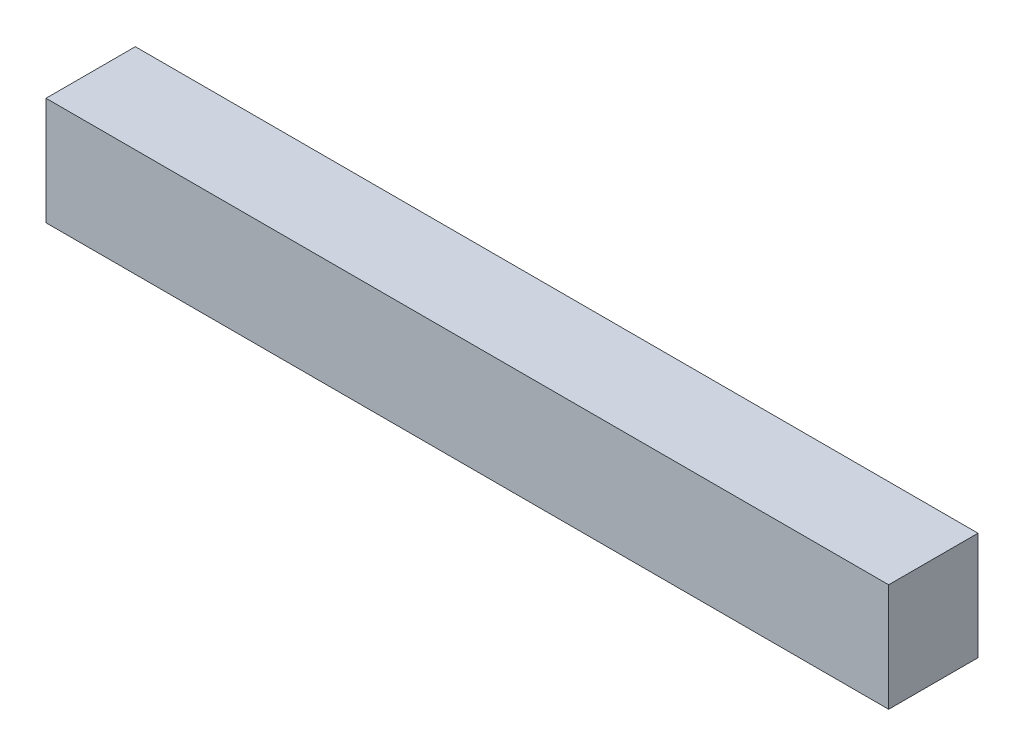
ISO-10303-21;
HEADER;
FILE_DESCRIPTION(('STEP AP214'),'2;1');
FILE_NAME('part.step','',(''),(''),'','','');
FILE_SCHEMA(('AUTOMOTIVE_DESIGN { 1 0 10303 214 1 1 1 1 }'));
ENDSEC;
DATA;
#1=APPLICATION_CONTEXT('core data for automotive mechanical design processes');
#2=APPLICATION_PROTOCOL_DEFINITION('international standard','automotive_design',2000,#1);
#3=PRODUCT_CONTEXT('',#1,'mechanical');
#4=PRODUCT('Part','Part','',(#3));
#5=PRODUCT_RELATED_PRODUCT_CATEGORY('part','',(#4));
#6=PRODUCT_DEFINITION_FORMATION('','',#4);
#7=PRODUCT_DEFINITION_CONTEXT('part definition',#1,'design');
#8=PRODUCT_DEFINITION('design','',#6,#7);
#9=PRODUCT_DEFINITION_SHAPE('','',#8);
#10=(LENGTH_UNIT() NAMED_UNIT(*) SI_UNIT(.MILLI.,.METRE.));
#11=(NAMED_UNIT(*) PLANE_ANGLE_UNIT() SI_UNIT($,.RADIAN.));
#12=(NAMED_UNIT(*) SI_UNIT($,.STERADIAN.) SOLID_ANGLE_UNIT());
#13=UNCERTAINTY_MEASURE_WITH_UNIT(LENGTH_MEASURE(1.E-05),#10,'distance_accuracy_value','');
#14=(GEOMETRIC_REPRESENTATION_CONTEXT(3) GLOBAL_UNCERTAINTY_ASSIGNED_CONTEXT((#13)) GLOBAL_UNIT_ASSIGNED_CONTEXT((#10,
#11,#12)) REPRESENTATION_CONTEXT('',''));
#15=CARTESIAN_POINT('',(0.,0.,0.));
#16=DIRECTION('',(0.,0.,1.));
#17=DIRECTION('',(1.,0.,0.));
#18=AXIS2_PLACEMENT_3D('',#15,#16,#17);
#19=CARTESIAN_POINT('',(0.,0.,3.18));
#20=DIRECTION('',(1.,0.,0.));
#21=DIRECTION('',(0.,0.,-1.));
#22=AXIS2_PLACEMENT_3D('',#19,#20,#21);
#23=PLANE('',#22);
#24=DIRECTION('',(0.,-1.,0.));
#25=VECTOR('',#24,1.);
#26=CARTESIAN_POINT('',(0.,0.,0.));
#27=LINE('',#26,#25);
#28=CARTESIAN_POINT('',(0.,3.84,0.));
#29=VERTEX_POINT('',#28);
#30=CARTESIAN_POINT('',(0.,0.,0.));
#31=VERTEX_POINT('',#30);
#32=EDGE_CURVE('E100',#29,#31,#27,.T.);
#33=ORIENTED_EDGE('',*,*,#32,.T.);
#34=DIRECTION('',(0.,0.,-1.));
#35=VECTOR('',#34,1.);
#36=CARTESIAN_POINT('',(0.,0.,3.18));
#37=LINE('',#36,#35);
#38=CARTESIAN_POINT('',(0.,0.,3.18));
#39=VERTEX_POINT('',#38);
#40=EDGE_CURVE('E11',#39,#31,#37,.T.);
#41=ORIENTED_EDGE('',*,*,#40,.F.);
#42=DIRECTION('',(0.,-1.,0.));
#43=VECTOR('',#42,1.);
#44=CARTESIAN_POINT('',(0.,0.,3.18));
#45=LINE('',#44,#43);
#46=CARTESIAN_POINT('',(0.,3.84,3.18));
#47=VERTEX_POINT('',#46);
#48=EDGE_CURVE('E88',#47,#39,#45,.T.);
#49=ORIENTED_EDGE('',*,*,#48,.F.);
#50=DIRECTION('',(0.,0.,-1.));
#51=VECTOR('',#50,1.);
#52=CARTESIAN_POINT('',(0.,3.84,3.18));
#53=LINE('',#52,#51);
#54=EDGE_CURVE('E96',#47,#29,#53,.T.);
#55=ORIENTED_EDGE('',*,*,#54,.T.);
#56=EDGE_LOOP('',(#33,#41,#49,#55));
#57=FACE_BOUND('',#56,.T.);
#58=ADVANCED_FACE('F37',(#57),#23,.F.);
#59=CARTESIAN_POINT('',(0.,0.,3.18));
#60=DIRECTION('',(0.,1.,0.));
#61=DIRECTION('',(0.,0.,1.));
#62=AXIS2_PLACEMENT_3D('',#59,#60,#61);
#63=PLANE('',#62);
#64=DIRECTION('',(1.,0.,0.));
#65=VECTOR('',#64,1.);
#66=CARTESIAN_POINT('',(0.,0.,0.));
#67=LINE('',#66,#65);
#68=CARTESIAN_POINT('',(30.,0.,0.));
#69=VERTEX_POINT('',#68);
#70=EDGE_CURVE('E92',#31,#69,#67,.T.);
#71=ORIENTED_EDGE('',*,*,#70,.T.);
#72=DIRECTION('',(0.,0.,-1.));
#73=VECTOR('',#72,1.);
#74=CARTESIAN_POINT('',(30.,0.,3.18));
#75=LINE('',#74,#73);
#76=CARTESIAN_POINT('',(30.,0.,3.18));
#77=VERTEX_POINT('',#76);
#78=EDGE_CURVE('E45',#77,#69,#75,.T.);
#79=ORIENTED_EDGE('',*,*,#78,.F.);
#80=DIRECTION('',(1.,0.,0.));
#81=VECTOR('',#80,1.);
#82=CARTESIAN_POINT('',(0.,0.,3.18));
#83=LINE('',#82,#81);
#84=EDGE_CURVE('E83',#39,#77,#83,.T.);
#85=ORIENTED_EDGE('',*,*,#84,.F.);
#86=ORIENTED_EDGE('',*,*,#40,.T.);
#87=EDGE_LOOP('',(#71,#79,#85,#86));
#88=FACE_BOUND('',#87,.T.);
#89=ADVANCED_FACE('F91',(#88),#63,.F.);
#90=CARTESIAN_POINT('',(30.,0.,3.18));
#91=DIRECTION('',(-1.,0.,0.));
#92=DIRECTION('',(0.,0.,1.));
#93=AXIS2_PLACEMENT_3D('',#90,#91,#92);
#94=PLANE('',#93);
#95=DIRECTION('',(0.,1.,0.));
#96=VECTOR('',#95,1.);
#97=CARTESIAN_POINT('',(30.,0.,0.));
#98=LINE('',#97,#96);
#99=CARTESIAN_POINT('',(30.,3.84,0.));
#100=VERTEX_POINT('',#99);
#101=EDGE_CURVE('E70',#69,#100,#98,.T.);
#102=ORIENTED_EDGE('',*,*,#101,.T.);
#103=DIRECTION('',(0.,0.,-1.));
#104=VECTOR('',#103,1.);
#105=CARTESIAN_POINT('',(30.,3.84,3.18));
#106=LINE('',#105,#104);
#107=CARTESIAN_POINT('',(30.,3.84,3.18));
#108=VERTEX_POINT('',#107);
#109=EDGE_CURVE('E93',#108,#100,#106,.T.);
#110=ORIENTED_EDGE('',*,*,#109,.F.);
#111=DIRECTION('',(0.,1.,0.));
#112=VECTOR('',#111,1.);
#113=CARTESIAN_POINT('',(30.,0.,3.18));
#114=LINE('',#113,#112);
#115=EDGE_CURVE('E86',#77,#108,#114,.T.);
#116=ORIENTED_EDGE('',*,*,#115,.F.);
#117=ORIENTED_EDGE('',*,*,#78,.T.);
#118=EDGE_LOOP('',(#102,#110,#116,#117));
#119=FACE_BOUND('',#118,.T.);
#120=ADVANCED_FACE('F94',(#119),#94,.F.);
#121=CARTESIAN_POINT('',(0.,3.84,3.18));
#122=DIRECTION('',(0.,-1.,0.));
#123=DIRECTION('',(0.,0.,-1.));
#124=AXIS2_PLACEMENT_3D('',#121,#122,#123);
#125=PLANE('',#124);
#126=DIRECTION('',(-1.,0.,0.));
#127=VECTOR('',#126,1.);
#128=CARTESIAN_POINT('',(0.,3.84,0.));
#129=LINE('',#128,#127);
#130=EDGE_CURVE('E76',#100,#29,#129,.T.);
#131=ORIENTED_EDGE('',*,*,#130,.T.);
#132=ORIENTED_EDGE('',*,*,#54,.F.);
#133=DIRECTION('',(-1.,0.,0.));
#134=VECTOR('',#133,1.);
#135=CARTESIAN_POINT('',(0.,3.84,3.18));
#136=LINE('',#135,#134);
#137=EDGE_CURVE('E53',#108,#47,#136,.T.);
#138=ORIENTED_EDGE('',*,*,#137,.F.);
#139=ORIENTED_EDGE('',*,*,#109,.T.);
#140=EDGE_LOOP('',(#131,#132,#138,#139));
#141=FACE_BOUND('',#140,.T.);
#142=ADVANCED_FACE('F107',(#141),#125,.F.);
#143=CARTESIAN_POINT('',(0.,0.,3.18));
#144=DIRECTION('',(0.,0.,-1.));
#145=DIRECTION('',(-1.,0.,0.));
#146=AXIS2_PLACEMENT_3D('',#143,#144,#145);
#147=PLANE('',#146);
#148=ORIENTED_EDGE('',*,*,#48,.T.);
#149=ORIENTED_EDGE('',*,*,#84,.T.);
#150=ORIENTED_EDGE('',*,*,#115,.T.);
#151=ORIENTED_EDGE('',*,*,#137,.T.);
#152=EDGE_LOOP('',(#148,#149,#150,#151));
#153=FACE_BOUND('',#152,.T.);
#154=ADVANCED_FACE('F84',(#153),#147,.F.);
#155=CARTESIAN_POINT('',(0.,0.,0.));
#156=DIRECTION('',(0.,0.,-1.));
#157=DIRECTION('',(-1.,0.,0.));
#158=AXIS2_PLACEMENT_3D('',#155,#156,#157);
#159=PLANE('',#158);
#160=ORIENTED_EDGE('',*,*,#32,.F.);
#161=ORIENTED_EDGE('',*,*,#130,.F.);
#162=ORIENTED_EDGE('',*,*,#101,.F.);
#163=ORIENTED_EDGE('',*,*,#70,.F.);
#164=EDGE_LOOP('',(#160,#161,#162,#163));
#165=FACE_BOUND('',#164,.T.);
#166=ADVANCED_FACE('F110',(#165),#159,.T.);
#167=CLOSED_SHELL('',(#58,#89,#120,#142,#154,#166));
#168=MANIFOLD_SOLID_BREP('B2',#167);
#169=ADVANCED_BREP_SHAPE_REPRESENTATION('',(#18,#168),#14);
#170=SHAPE_DEFINITION_REPRESENTATION(#9,#169);
ENDSEC;
END-ISO-10303-21;
